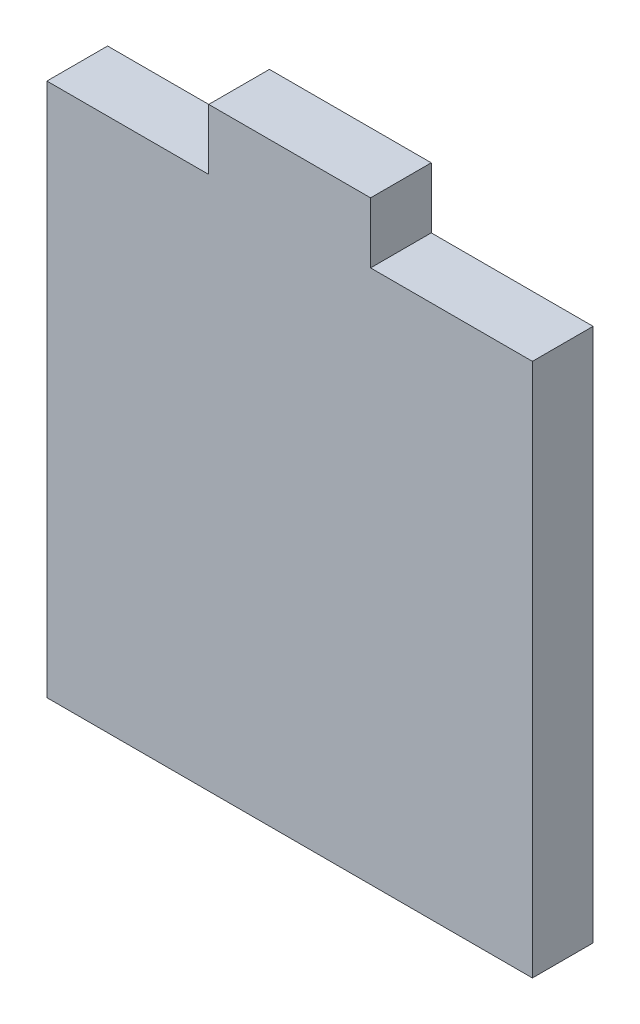
ISO-10303-21;
HEADER;
FILE_DESCRIPTION(('STEP AP214'),'2;1');
FILE_NAME('part.step','',(''),(''),'','','');
FILE_SCHEMA(('AUTOMOTIVE_DESIGN { 1 0 10303 214 1 1 1 1 }'));
ENDSEC;
DATA;
#1=APPLICATION_CONTEXT('core data for automotive mechanical design processes');
#2=APPLICATION_PROTOCOL_DEFINITION('international standard','automotive_design',2000,#1);
#3=PRODUCT_CONTEXT('',#1,'mechanical');
#4=PRODUCT('Part','Part','',(#3));
#5=PRODUCT_RELATED_PRODUCT_CATEGORY('part','',(#4));
#6=PRODUCT_DEFINITION_FORMATION('','',#4);
#7=PRODUCT_DEFINITION_CONTEXT('part definition',#1,'design');
#8=PRODUCT_DEFINITION('design','',#6,#7);
#9=PRODUCT_DEFINITION_SHAPE('','',#8);
#10=(LENGTH_UNIT() NAMED_UNIT(*) SI_UNIT(.MILLI.,.METRE.));
#11=(NAMED_UNIT(*) PLANE_ANGLE_UNIT() SI_UNIT($,.RADIAN.));
#12=(NAMED_UNIT(*) SI_UNIT($,.STERADIAN.) SOLID_ANGLE_UNIT());
#13=UNCERTAINTY_MEASURE_WITH_UNIT(LENGTH_MEASURE(1.E-05),#10,'distance_accuracy_value','');
#14=(GEOMETRIC_REPRESENTATION_CONTEXT(3) GLOBAL_UNCERTAINTY_ASSIGNED_CONTEXT((#13)) GLOBAL_UNIT_ASSIGNED_CONTEXT((#10,
#11,#12)) REPRESENTATION_CONTEXT('',''));
#15=CARTESIAN_POINT('',(0.,0.,0.));
#16=DIRECTION('',(0.,0.,1.));
#17=DIRECTION('',(1.,0.,0.));
#18=AXIS2_PLACEMENT_3D('',#15,#16,#17);
#19=CARTESIAN_POINT('',(0.,0.,4.7625));
#20=DIRECTION('',(1.,0.,0.));
#21=DIRECTION('',(0.,0.,-1.));
#22=AXIS2_PLACEMENT_3D('',#19,#20,#21);
#23=PLANE('',#22);
#24=DIRECTION('',(0.,-1.,0.));
#25=VECTOR('',#24,1.);
#26=CARTESIAN_POINT('',(0.,0.,0.));
#27=LINE('',#26,#25);
#28=CARTESIAN_POINT('',(0.,41.91,0.));
#29=VERTEX_POINT('',#28);
#30=CARTESIAN_POINT('',(0.,0.,0.));
#31=VERTEX_POINT('',#30);
#32=EDGE_CURVE('E131',#29,#31,#27,.T.);
#33=ORIENTED_EDGE('',*,*,#32,.T.);
#34=DIRECTION('',(0.,0.,-1.));
#35=VECTOR('',#34,1.);
#36=CARTESIAN_POINT('',(0.,0.,4.7625));
#37=LINE('',#36,#35);
#38=CARTESIAN_POINT('',(0.,0.,4.7625));
#39=VERTEX_POINT('',#38);
#40=EDGE_CURVE('E11',#39,#31,#37,.T.);
#41=ORIENTED_EDGE('',*,*,#40,.F.);
#42=DIRECTION('',(0.,-1.,0.));
#43=VECTOR('',#42,1.);
#44=CARTESIAN_POINT('',(0.,0.,4.7625));
#45=LINE('',#44,#43);
#46=CARTESIAN_POINT('',(0.,41.91,4.7625));
#47=VERTEX_POINT('',#46);
#48=EDGE_CURVE('E145',#47,#39,#45,.T.);
#49=ORIENTED_EDGE('',*,*,#48,.F.);
#50=DIRECTION('',(0.,0.,-1.));
#51=VECTOR('',#50,1.);
#52=CARTESIAN_POINT('',(0.,41.91,4.7625));
#53=LINE('',#52,#51);
#54=EDGE_CURVE('E127',#47,#29,#53,.T.);
#55=ORIENTED_EDGE('',*,*,#54,.T.);
#56=EDGE_LOOP('',(#33,#41,#49,#55));
#57=FACE_BOUND('',#56,.T.);
#58=ADVANCED_FACE('F35',(#57),#23,.F.);
#59=CARTESIAN_POINT('',(0.,0.,4.7625));
#60=DIRECTION('',(0.,1.,0.));
#61=DIRECTION('',(0.,0.,1.));
#62=AXIS2_PLACEMENT_3D('',#59,#60,#61);
#63=PLANE('',#62);
#64=DIRECTION('',(1.,0.,0.));
#65=VECTOR('',#64,1.);
#66=CARTESIAN_POINT('',(0.,0.,0.));
#67=LINE('',#66,#65);
#68=CARTESIAN_POINT('',(38.1,0.,0.));
#69=VERTEX_POINT('',#68);
#70=EDGE_CURVE('E134',#31,#69,#67,.T.);
#71=ORIENTED_EDGE('',*,*,#70,.T.);
#72=DIRECTION('',(0.,0.,-1.));
#73=VECTOR('',#72,1.);
#74=CARTESIAN_POINT('',(38.1,0.,4.7625));
#75=LINE('',#74,#73);
#76=CARTESIAN_POINT('',(38.1,0.,4.7625));
#77=VERTEX_POINT('',#76);
#78=EDGE_CURVE('E43',#77,#69,#75,.T.);
#79=ORIENTED_EDGE('',*,*,#78,.F.);
#80=DIRECTION('',(1.,0.,0.));
#81=VECTOR('',#80,1.);
#82=CARTESIAN_POINT('',(0.,0.,4.7625));
#83=LINE('',#82,#81);
#84=EDGE_CURVE('E94',#39,#77,#83,.T.);
#85=ORIENTED_EDGE('',*,*,#84,.F.);
#86=ORIENTED_EDGE('',*,*,#40,.T.);
#87=EDGE_LOOP('',(#71,#79,#85,#86));
#88=FACE_BOUND('',#87,.T.);
#89=ADVANCED_FACE('F180',(#88),#63,.F.);
#90=CARTESIAN_POINT('',(38.1,0.,4.7625));
#91=DIRECTION('',(-1.,0.,0.));
#92=DIRECTION('',(0.,0.,1.));
#93=AXIS2_PLACEMENT_3D('',#90,#91,#92);
#94=PLANE('',#93);
#95=DIRECTION('',(0.,1.,0.));
#96=VECTOR('',#95,1.);
#97=CARTESIAN_POINT('',(38.1,0.,0.));
#98=LINE('',#97,#96);
#99=CARTESIAN_POINT('',(38.1,41.91,0.));
#100=VERTEX_POINT('',#99);
#101=EDGE_CURVE('E136',#69,#100,#98,.T.);
#102=ORIENTED_EDGE('',*,*,#101,.T.);
#103=DIRECTION('',(0.,0.,-1.));
#104=VECTOR('',#103,1.);
#105=CARTESIAN_POINT('',(38.1,41.91,4.7625));
#106=LINE('',#105,#104);
#107=CARTESIAN_POINT('',(38.1,41.91,4.7625));
#108=VERTEX_POINT('',#107);
#109=EDGE_CURVE('E152',#108,#100,#106,.T.);
#110=ORIENTED_EDGE('',*,*,#109,.F.);
#111=DIRECTION('',(0.,1.,0.));
#112=VECTOR('',#111,1.);
#113=CARTESIAN_POINT('',(38.1,0.,4.7625));
#114=LINE('',#113,#112);
#115=EDGE_CURVE('E160',#77,#108,#114,.T.);
#116=ORIENTED_EDGE('',*,*,#115,.F.);
#117=ORIENTED_EDGE('',*,*,#78,.T.);
#118=EDGE_LOOP('',(#102,#110,#116,#117));
#119=FACE_BOUND('',#118,.T.);
#120=ADVANCED_FACE('F158',(#119),#94,.F.);
#121=CARTESIAN_POINT('',(25.4,41.91,4.7625));
#122=DIRECTION('',(0.,-1.,0.));
#123=DIRECTION('',(1.,0.,0.));
#124=AXIS2_PLACEMENT_3D('',#121,#122,#123);
#125=PLANE('',#124);
#126=DIRECTION('',(-1.,0.,0.));
#127=VECTOR('',#126,1.);
#128=CARTESIAN_POINT('',(25.4,41.91,0.));
#129=LINE('',#128,#127);
#130=CARTESIAN_POINT('',(25.4,41.91,0.));
#131=VERTEX_POINT('',#130);
#132=EDGE_CURVE('E138',#100,#131,#129,.T.);
#133=ORIENTED_EDGE('',*,*,#132,.T.);
#134=DIRECTION('',(0.,0.,-1.));
#135=VECTOR('',#134,1.);
#136=CARTESIAN_POINT('',(25.4,41.91,4.7625));
#137=LINE('',#136,#135);
#138=CARTESIAN_POINT('',(25.4,41.91,4.7625));
#139=VERTEX_POINT('',#138);
#140=EDGE_CURVE('E149',#139,#131,#137,.T.);
#141=ORIENTED_EDGE('',*,*,#140,.F.);
#142=DIRECTION('',(-1.,0.,0.));
#143=VECTOR('',#142,1.);
#144=CARTESIAN_POINT('',(25.4,41.91,4.7625));
#145=LINE('',#144,#143);
#146=EDGE_CURVE('E172',#108,#139,#145,.T.);
#147=ORIENTED_EDGE('',*,*,#146,.F.);
#148=ORIENTED_EDGE('',*,*,#109,.T.);
#149=EDGE_LOOP('',(#133,#141,#147,#148));
#150=FACE_BOUND('',#149,.T.);
#151=ADVANCED_FACE('F168',(#150),#125,.F.);
#152=CARTESIAN_POINT('',(25.4,41.91,4.7625));
#153=DIRECTION('',(-1.,0.,0.));
#154=DIRECTION('',(0.,0.,1.));
#155=AXIS2_PLACEMENT_3D('',#152,#153,#154);
#156=PLANE('',#155);
#157=DIRECTION('',(0.,1.,0.));
#158=VECTOR('',#157,1.);
#159=CARTESIAN_POINT('',(25.4,41.91,0.));
#160=LINE('',#159,#158);
#161=CARTESIAN_POINT('',(25.4,46.6725,0.));
#162=VERTEX_POINT('',#161);
#163=EDGE_CURVE('E140',#131,#162,#160,.T.);
#164=ORIENTED_EDGE('',*,*,#163,.T.);
#165=DIRECTION('',(0.,0.,-1.));
#166=VECTOR('',#165,1.);
#167=CARTESIAN_POINT('',(25.4,46.6725,4.7625));
#168=LINE('',#167,#166);
#169=CARTESIAN_POINT('',(25.4,46.6725,4.7625));
#170=VERTEX_POINT('',#169);
#171=EDGE_CURVE('E122',#170,#162,#168,.T.);
#172=ORIENTED_EDGE('',*,*,#171,.F.);
#173=DIRECTION('',(0.,1.,0.));
#174=VECTOR('',#173,1.);
#175=CARTESIAN_POINT('',(25.4,41.91,4.7625));
#176=LINE('',#175,#174);
#177=EDGE_CURVE('E113',#139,#170,#176,.T.);
#178=ORIENTED_EDGE('',*,*,#177,.F.);
#179=ORIENTED_EDGE('',*,*,#140,.T.);
#180=EDGE_LOOP('',(#164,#172,#178,#179));
#181=FACE_BOUND('',#180,.T.);
#182=ADVANCED_FACE('F171',(#181),#156,.F.);
#183=CARTESIAN_POINT('',(12.7,46.6725,4.7625));
#184=DIRECTION('',(0.,-1.,0.));
#185=DIRECTION('',(0.,0.,-1.));
#186=AXIS2_PLACEMENT_3D('',#183,#184,#185);
#187=PLANE('',#186);
#188=DIRECTION('',(-1.,0.,0.));
#189=VECTOR('',#188,1.);
#190=CARTESIAN_POINT('',(12.7,46.6725,0.));
#191=LINE('',#190,#189);
#192=CARTESIAN_POINT('',(12.7,46.6725,0.));
#193=VERTEX_POINT('',#192);
#194=EDGE_CURVE('E121',#162,#193,#191,.T.);
#195=ORIENTED_EDGE('',*,*,#194,.T.);
#196=DIRECTION('',(0.,0.,-1.));
#197=VECTOR('',#196,1.);
#198=CARTESIAN_POINT('',(12.7,46.6725,4.7625));
#199=LINE('',#198,#197);
#200=CARTESIAN_POINT('',(12.7,46.6725,4.7625));
#201=VERTEX_POINT('',#200);
#202=EDGE_CURVE('E118',#201,#193,#199,.T.);
#203=ORIENTED_EDGE('',*,*,#202,.F.);
#204=DIRECTION('',(-1.,0.,0.));
#205=VECTOR('',#204,1.);
#206=CARTESIAN_POINT('',(12.7,46.6725,4.7625));
#207=LINE('',#206,#205);
#208=EDGE_CURVE('E107',#170,#201,#207,.T.);
#209=ORIENTED_EDGE('',*,*,#208,.F.);
#210=ORIENTED_EDGE('',*,*,#171,.T.);
#211=EDGE_LOOP('',(#195,#203,#209,#210));
#212=FACE_BOUND('',#211,.T.);
#213=ADVANCED_FACE('F119',(#212),#187,.F.);
#214=CARTESIAN_POINT('',(12.7,41.91,4.7625));
#215=DIRECTION('',(1.,0.,0.));
#216=DIRECTION('',(0.,0.,-1.));
#217=AXIS2_PLACEMENT_3D('',#214,#215,#216);
#218=PLANE('',#217);
#219=DIRECTION('',(0.,-1.,0.));
#220=VECTOR('',#219,1.);
#221=CARTESIAN_POINT('',(12.7,41.91,0.));
#222=LINE('',#221,#220);
#223=CARTESIAN_POINT('',(12.7,41.91,0.));
#224=VERTEX_POINT('',#223);
#225=EDGE_CURVE('E80',#193,#224,#222,.T.);
#226=ORIENTED_EDGE('',*,*,#225,.T.);
#227=DIRECTION('',(0.,0.,-1.));
#228=VECTOR('',#227,1.);
#229=CARTESIAN_POINT('',(12.7,41.91,4.7625));
#230=LINE('',#229,#228);
#231=CARTESIAN_POINT('',(12.7,41.91,4.7625));
#232=VERTEX_POINT('',#231);
#233=EDGE_CURVE('E123',#232,#224,#230,.T.);
#234=ORIENTED_EDGE('',*,*,#233,.F.);
#235=DIRECTION('',(0.,-1.,0.));
#236=VECTOR('',#235,1.);
#237=CARTESIAN_POINT('',(12.7,41.91,4.7625));
#238=LINE('',#237,#236);
#239=EDGE_CURVE('E111',#201,#232,#238,.T.);
#240=ORIENTED_EDGE('',*,*,#239,.F.);
#241=ORIENTED_EDGE('',*,*,#202,.T.);
#242=EDGE_LOOP('',(#226,#234,#240,#241));
#243=FACE_BOUND('',#242,.T.);
#244=ADVANCED_FACE('F125',(#243),#218,.F.);
#245=CARTESIAN_POINT('',(0.,41.91,4.7625));
#246=DIRECTION('',(0.,-1.,0.));
#247=DIRECTION('',(0.,0.,-1.));
#248=AXIS2_PLACEMENT_3D('',#245,#246,#247);
#249=PLANE('',#248);
#250=DIRECTION('',(-1.,0.,0.));
#251=VECTOR('',#250,1.);
#252=CARTESIAN_POINT('',(0.,41.91,0.));
#253=LINE('',#252,#251);
#254=EDGE_CURVE('E86',#224,#29,#253,.T.);
#255=ORIENTED_EDGE('',*,*,#254,.T.);
#256=ORIENTED_EDGE('',*,*,#54,.F.);
#257=DIRECTION('',(-1.,0.,0.));
#258=VECTOR('',#257,1.);
#259=CARTESIAN_POINT('',(0.,41.91,4.7625));
#260=LINE('',#259,#258);
#261=EDGE_CURVE('E51',#232,#47,#260,.T.);
#262=ORIENTED_EDGE('',*,*,#261,.F.);
#263=ORIENTED_EDGE('',*,*,#233,.T.);
#264=EDGE_LOOP('',(#255,#256,#262,#263));
#265=FACE_BOUND('',#264,.T.);
#266=ADVANCED_FACE('F196',(#265),#249,.F.);
#267=CARTESIAN_POINT('',(0.,0.,4.7625));
#268=DIRECTION('',(0.,0.,-1.));
#269=DIRECTION('',(-1.,0.,0.));
#270=AXIS2_PLACEMENT_3D('',#267,#268,#269);
#271=PLANE('',#270);
#272=ORIENTED_EDGE('',*,*,#48,.T.);
#273=ORIENTED_EDGE('',*,*,#84,.T.);
#274=ORIENTED_EDGE('',*,*,#115,.T.);
#275=ORIENTED_EDGE('',*,*,#146,.T.);
#276=ORIENTED_EDGE('',*,*,#177,.T.);
#277=ORIENTED_EDGE('',*,*,#208,.T.);
#278=ORIENTED_EDGE('',*,*,#239,.T.);
#279=ORIENTED_EDGE('',*,*,#261,.T.);
#280=EDGE_LOOP('',(#272,#273,#274,#275,#276,#277,#278,#279));
#281=FACE_BOUND('',#280,.T.);
#282=ADVANCED_FACE('F109',(#281),#271,.F.);
#283=CARTESIAN_POINT('',(0.,0.,0.));
#284=DIRECTION('',(0.,0.,-1.));
#285=DIRECTION('',(-1.,0.,0.));
#286=AXIS2_PLACEMENT_3D('',#283,#284,#285);
#287=PLANE('',#286);
#288=ORIENTED_EDGE('',*,*,#32,.F.);
#289=ORIENTED_EDGE('',*,*,#254,.F.);
#290=ORIENTED_EDGE('',*,*,#225,.F.);
#291=ORIENTED_EDGE('',*,*,#194,.F.);
#292=ORIENTED_EDGE('',*,*,#163,.F.);
#293=ORIENTED_EDGE('',*,*,#132,.F.);
#294=ORIENTED_EDGE('',*,*,#101,.F.);
#295=ORIENTED_EDGE('',*,*,#70,.F.);
#296=EDGE_LOOP('',(#288,#289,#290,#291,#292,#293,#294,#295));
#297=FACE_BOUND('',#296,.T.);
#298=ADVANCED_FACE('F164',(#297),#287,.T.);
#299=CLOSED_SHELL('',(#58,#89,#120,#151,#182,#213,#244,#266,#282,#298));
#300=MANIFOLD_SOLID_BREP('B2',#299);
#301=ADVANCED_BREP_SHAPE_REPRESENTATION('',(#18,#300),#14);
#302=SHAPE_DEFINITION_REPRESENTATION(#9,#301);
ENDSEC;
END-ISO-10303-21;
